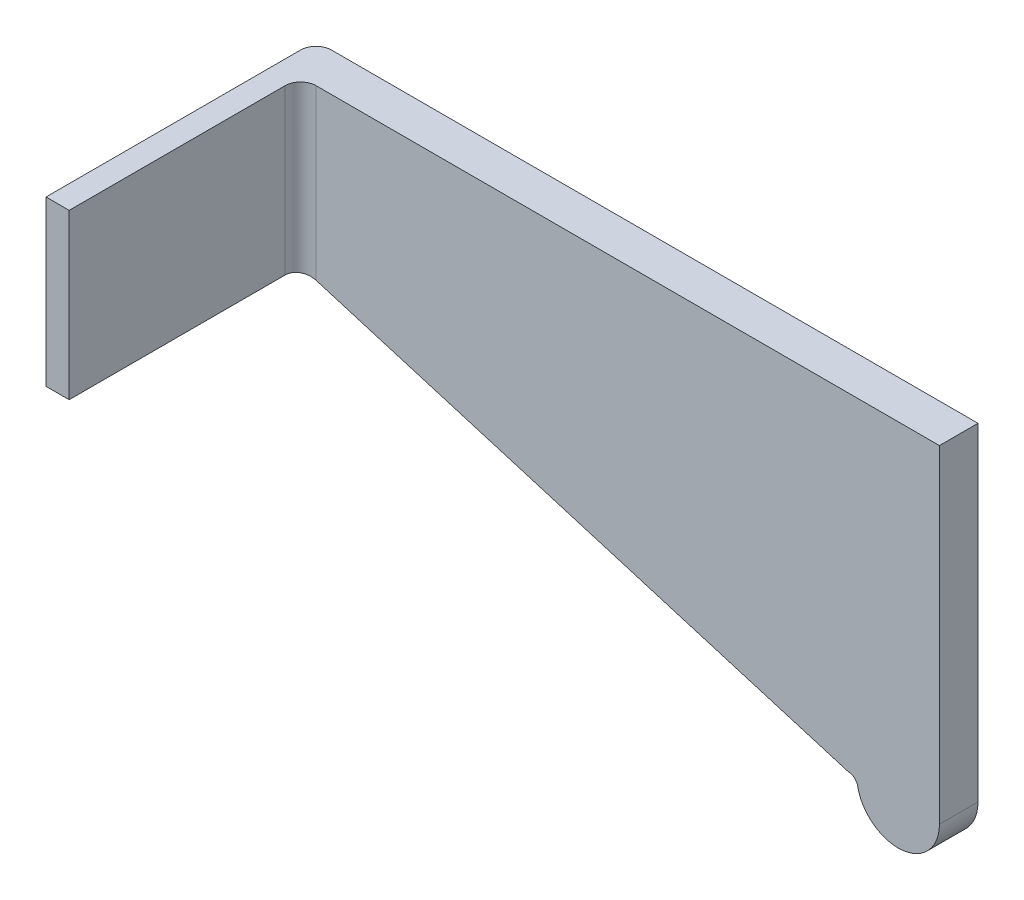
ISO-10303-21;
HEADER;
FILE_DESCRIPTION(('STEP AP214'),'2;1');
FILE_NAME('part.step','',(''),(''),'','','');
FILE_SCHEMA(('AUTOMOTIVE_DESIGN { 1 0 10303 214 1 1 1 1 }'));
ENDSEC;
DATA;
#1=APPLICATION_CONTEXT('core data for automotive mechanical design processes');
#2=APPLICATION_PROTOCOL_DEFINITION('international standard','automotive_design',2000,#1);
#3=PRODUCT_CONTEXT('',#1,'mechanical');
#4=PRODUCT('Part','Part','',(#3));
#5=PRODUCT_RELATED_PRODUCT_CATEGORY('part','',(#4));
#6=PRODUCT_DEFINITION_FORMATION('','',#4);
#7=PRODUCT_DEFINITION_CONTEXT('part definition',#1,'design');
#8=PRODUCT_DEFINITION('design','',#6,#7);
#9=PRODUCT_DEFINITION_SHAPE('','',#8);
#10=(LENGTH_UNIT() NAMED_UNIT(*) SI_UNIT(.MILLI.,.METRE.));
#11=(NAMED_UNIT(*) PLANE_ANGLE_UNIT() SI_UNIT($,.RADIAN.));
#12=(NAMED_UNIT(*) SI_UNIT($,.STERADIAN.) SOLID_ANGLE_UNIT());
#13=UNCERTAINTY_MEASURE_WITH_UNIT(LENGTH_MEASURE(1.E-05),#10,'distance_accuracy_value','');
#14=(GEOMETRIC_REPRESENTATION_CONTEXT(3) GLOBAL_UNCERTAINTY_ASSIGNED_CONTEXT((#13)) GLOBAL_UNIT_ASSIGNED_CONTEXT((#10,
#11,#12)) REPRESENTATION_CONTEXT('',''));
#15=CARTESIAN_POINT('',(0.,0.,0.));
#16=DIRECTION('',(0.,0.,1.));
#17=DIRECTION('',(1.,0.,0.));
#18=AXIS2_PLACEMENT_3D('',#15,#16,#17);
#19=CARTESIAN_POINT('',(-75.4580031388098,21.2470896781961,7.));
#20=DIRECTION('',(0.,-1.,0.));
#21=DIRECTION('',(0.,0.,-1.));
#22=AXIS2_PLACEMENT_3D('',#19,#20,#21);
#23=CYLINDRICAL_SURFACE('',#22,2.);
#24=DIRECTION('',(0.,1.,0.));
#25=VECTOR('',#24,1.);
#26=CARTESIAN_POINT('',(-77.4580031388098,21.2470896781961,7.));
#27=LINE('',#26,#25);
#28=CARTESIAN_POINT('',(-77.4580031388098,21.2535448390981,7.00000000000001));
#29=VERTEX_POINT('',#28);
#30=CARTESIAN_POINT('',(-77.4580031388098,42.5070896781962,7.));
#31=VERTEX_POINT('',#30);
#32=EDGE_CURVE('E266',#29,#31,#27,.T.);
#33=ORIENTED_EDGE('',*,*,#32,.F.);
#34=CARTESIAN_POINT('',(-75.4580031388098,20.6545045645001,7.));
#35=DIRECTION('',(0.286926127643944,0.957952711398246,0.));
#36=DIRECTION('',(0.957952711398246,-0.286926127643944,0.));
#37=AXIS2_PLACEMENT_3D('',#34,#35,#36);
#38=ELLIPSE('',#37,2.08778572908966,2.);
#39=CARTESIAN_POINT('',(-75.4580031388098,20.6545045645001,5.));
#40=VERTEX_POINT('',#39);
#41=EDGE_CURVE('E47',#29,#40,#38,.F.);
#42=ORIENTED_EDGE('',*,*,#41,.T.);
#43=DIRECTION('',(0.,1.,0.));
#44=VECTOR('',#43,1.);
#45=CARTESIAN_POINT('',(-75.4580031388098,21.2470896781961,5.));
#46=LINE('',#45,#44);
#47=CARTESIAN_POINT('',(-75.4580031388098,42.5070896781962,5.));
#48=VERTEX_POINT('',#47);
#49=EDGE_CURVE('E273',#48,#40,#46,.F.);
#50=ORIENTED_EDGE('',*,*,#49,.F.);
#51=CARTESIAN_POINT('',(-75.4580031388098,42.5070896781962,7.));
#52=DIRECTION('',(0.,-1.,0.));
#53=DIRECTION('',(0.,0.,-1.));
#54=AXIS2_PLACEMENT_3D('',#51,#52,#53);
#55=CIRCLE('',#54,2.);
#56=EDGE_CURVE('E11',#48,#31,#55,.F.);
#57=ORIENTED_EDGE('',*,*,#56,.T.);
#58=EDGE_LOOP('',(#33,#42,#50,#57));
#59=FACE_BOUND('',#58,.T.);
#60=ADVANCED_FACE('F39',(#59),#23,.F.);
#61=CARTESIAN_POINT('',(0.,0.,5.));
#62=DIRECTION('',(0.,0.,1.));
#63=DIRECTION('',(1.,0.,0.));
#64=AXIS2_PLACEMENT_3D('',#61,#62,#63);
#65=PLANE('',#64);
#66=DIRECTION('',(-1.,0.,0.));
#67=VECTOR('',#66,1.);
#68=CARTESIAN_POINT('',(-5.34810484739101,42.5070896781962,5.));
#69=LINE('',#68,#67);
#70=CARTESIAN_POINT('',(5.34810484739101,42.5070896781962,5.));
#71=VERTEX_POINT('',#70);
#72=EDGE_CURVE('E191',#71,#48,#69,.T.);
#73=ORIENTED_EDGE('',*,*,#72,.T.);
#74=ORIENTED_EDGE('',*,*,#49,.T.);
#75=DIRECTION('',(-0.957952711398246,0.286926127643944,0.));
#76=VECTOR('',#75,1.);
#77=CARTESIAN_POINT('',(-77.4580031388098,21.2535448390981,5.));
#78=LINE('',#77,#76);
#79=CARTESIAN_POINT('',(-6.49935230899251,0.,5.));
#80=VERTEX_POINT('',#79);
#81=EDGE_CURVE('E173',#80,#40,#78,.T.);
#82=ORIENTED_EDGE('',*,*,#81,.F.);
#83=CARTESIAN_POINT('',(-6.49935230899251,-1.27515777709302,5.));
#84=DIRECTION('',(0.,0.,1.));
#85=DIRECTION('',(1.,0.,0.));
#86=AXIS2_PLACEMENT_3D('',#83,#84,#85);
#87=CIRCLE('',#86,1.27515777709302);
#88=CARTESIAN_POINT('',(-5.24805062993144,-1.029655303664,5.));
#89=VERTEX_POINT('',#88);
#90=EDGE_CURVE('E230',#80,#89,#87,.F.);
#91=ORIENTED_EDGE('',*,*,#90,.T.);
#92=CARTESIAN_POINT('',(0.,0.,5.));
#93=DIRECTION('',(0.,0.,1.));
#94=DIRECTION('',(1.,0.,0.));
#95=AXIS2_PLACEMENT_3D('',#92,#93,#94);
#96=CIRCLE('',#95,5.34810484739101);
#97=CARTESIAN_POINT('',(5.34810484739101,0.,5.));
#98=VERTEX_POINT('',#97);
#99=EDGE_CURVE('E202',#89,#98,#96,.T.);
#100=ORIENTED_EDGE('',*,*,#99,.T.);
#101=DIRECTION('',(0.,1.,0.));
#102=VECTOR('',#101,1.);
#103=CARTESIAN_POINT('',(5.34810484739101,0.,5.));
#104=LINE('',#103,#102);
#105=EDGE_CURVE('E205',#98,#71,#104,.T.);
#106=ORIENTED_EDGE('',*,*,#105,.T.);
#107=EDGE_LOOP('',(#73,#74,#82,#91,#100,#106));
#108=FACE_BOUND('',#107,.T.);
#109=ADVANCED_FACE('F278',(#108),#65,.T.);
#110=CARTESIAN_POINT('',(-78.4580031388098,0.,2.));
#111=DIRECTION('',(0.,-1.,0.));
#112=DIRECTION('',(0.,0.,-1.));
#113=AXIS2_PLACEMENT_3D('',#110,#111,#112);
#114=CYLINDRICAL_SURFACE('',#113,2.);
#115=DIRECTION('',(0.,1.,0.));
#116=VECTOR('',#115,1.);
#117=CARTESIAN_POINT('',(-78.4580031388098,0.,0.));
#118=LINE('',#117,#116);
#119=CARTESIAN_POINT('',(-78.4580031388098,21.2470896781961,0.));
#120=VERTEX_POINT('',#119);
#121=CARTESIAN_POINT('',(-78.4580031388098,42.5070896781962,0.));
#122=VERTEX_POINT('',#121);
#123=EDGE_CURVE('E250',#120,#122,#118,.T.);
#124=ORIENTED_EDGE('',*,*,#123,.F.);
#125=CARTESIAN_POINT('',(-78.4580031388098,21.2470896781961,2.));
#126=DIRECTION('',(0.,-1.,0.));
#127=DIRECTION('',(0.,0.,-1.));
#128=AXIS2_PLACEMENT_3D('',#125,#126,#127);
#129=CIRCLE('',#128,2.);
#130=CARTESIAN_POINT('',(-80.4580031388098,21.2470896781961,2.));
#131=VERTEX_POINT('',#130);
#132=EDGE_CURVE('E256',#131,#120,#129,.T.);
#133=ORIENTED_EDGE('',*,*,#132,.F.);
#134=DIRECTION('',(0.,1.,0.));
#135=VECTOR('',#134,1.);
#136=CARTESIAN_POINT('',(-80.4580031388098,0.,2.));
#137=LINE('',#136,#135);
#138=CARTESIAN_POINT('',(-80.4580031388098,42.5070896781962,2.));
#139=VERTEX_POINT('',#138);
#140=EDGE_CURVE('E138',#139,#131,#137,.F.);
#141=ORIENTED_EDGE('',*,*,#140,.F.);
#142=CARTESIAN_POINT('',(-78.4580031388098,42.5070896781962,2.));
#143=DIRECTION('',(0.,-1.,0.));
#144=DIRECTION('',(0.,0.,-1.));
#145=AXIS2_PLACEMENT_3D('',#142,#143,#144);
#146=CIRCLE('',#145,2.);
#147=EDGE_CURVE('E259',#122,#139,#146,.F.);
#148=ORIENTED_EDGE('',*,*,#147,.F.);
#149=EDGE_LOOP('',(#124,#133,#141,#148));
#150=FACE_BOUND('',#149,.T.);
#151=ADVANCED_FACE('F303',(#150),#114,.T.);
#152=CARTESIAN_POINT('',(-78.0226272699365,17.2470896781961,35.));
#153=DIRECTION('',(0.,0.,1.));
#154=DIRECTION('',(1.,0.,0.));
#155=AXIS2_PLACEMENT_3D('',#152,#153,#154);
#156=CYLINDRICAL_SURFACE('',#155,4.);
#157=DIRECTION('',(0.,0.,1.));
#158=VECTOR('',#157,1.);
#159=CARTESIAN_POINT('',(-78.0226272699365,21.2470896781961,35.));
#160=LINE('',#159,#158);
#161=CARTESIAN_POINT('',(-78.0226272699365,21.2470896781961,0.));
#162=VERTEX_POINT('',#161);
#163=CARTESIAN_POINT('',(-78.0226272699365,21.2470896781961,5.));
#164=VERTEX_POINT('',#163);
#165=EDGE_CURVE('E236',#162,#164,#160,.T.);
#166=ORIENTED_EDGE('',*,*,#165,.F.);
#167=CARTESIAN_POINT('',(-78.0226272699365,17.2470896781961,0.));
#168=DIRECTION('',(0.,0.,1.));
#169=DIRECTION('',(1.,0.,0.));
#170=AXIS2_PLACEMENT_3D('',#167,#168,#169);
#171=CIRCLE('',#170,4.);
#172=CARTESIAN_POINT('',(-76.8749227593607,21.0789005237891,0.));
#173=VERTEX_POINT('',#172);
#174=EDGE_CURVE('E244',#162,#173,#171,.F.);
#175=ORIENTED_EDGE('',*,*,#174,.T.);
#176=DIRECTION('',(0.,0.,1.));
#177=VECTOR('',#176,1.);
#178=CARTESIAN_POINT('',(-76.8749227593607,21.0789005237891,0.));
#179=LINE('',#178,#177);
#180=CARTESIAN_POINT('',(-76.8749227593607,21.0789005237891,5.));
#181=VERTEX_POINT('',#180);
#182=EDGE_CURVE('E240',#181,#173,#179,.F.);
#183=ORIENTED_EDGE('',*,*,#182,.F.);
#184=CARTESIAN_POINT('',(-78.0226272699365,17.2470896781961,5.));
#185=DIRECTION('',(0.,0.,1.));
#186=DIRECTION('',(1.,0.,0.));
#187=AXIS2_PLACEMENT_3D('',#184,#185,#186);
#188=CIRCLE('',#187,4.);
#189=EDGE_CURVE('E247',#181,#164,#188,.T.);
#190=ORIENTED_EDGE('',*,*,#189,.T.);
#191=EDGE_LOOP('',(#166,#175,#183,#190));
#192=FACE_BOUND('',#191,.T.);
#193=ADVANCED_FACE('F316',(#192),#156,.F.);
#194=CARTESIAN_POINT('',(0.,0.,5.));
#195=DIRECTION('',(0.,0.,-1.));
#196=DIRECTION('',(-1.,0.,0.));
#197=AXIS2_PLACEMENT_3D('',#194,#195,#196);
#198=CYLINDRICAL_SURFACE('',#197,5.34810484739101);
#199=ORIENTED_EDGE('',*,*,#99,.F.);
#200=DIRECTION('',(0.,0.,-1.));
#201=VECTOR('',#200,1.);
#202=CARTESIAN_POINT('',(-5.24805062993144,-1.029655303664,5.));
#203=LINE('',#202,#201);
#204=CARTESIAN_POINT('',(-5.24805062993144,-1.029655303664,0.));
#205=VERTEX_POINT('',#204);
#206=EDGE_CURVE('E219',#89,#205,#203,.T.);
#207=ORIENTED_EDGE('',*,*,#206,.T.);
#208=CARTESIAN_POINT('',(0.,0.,0.));
#209=DIRECTION('',(0.,0.,1.));
#210=DIRECTION('',(1.,0.,0.));
#211=AXIS2_PLACEMENT_3D('',#208,#209,#210);
#212=CIRCLE('',#211,5.34810484739101);
#213=CARTESIAN_POINT('',(5.34810484739101,0.,0.));
#214=VERTEX_POINT('',#213);
#215=EDGE_CURVE('E198',#205,#214,#212,.T.);
#216=ORIENTED_EDGE('',*,*,#215,.T.);
#217=DIRECTION('',(0.,0.,-1.));
#218=VECTOR('',#217,1.);
#219=CARTESIAN_POINT('',(5.34810484739101,0.,5.));
#220=LINE('',#219,#218);
#221=EDGE_CURVE('E210',#98,#214,#220,.T.);
#222=ORIENTED_EDGE('',*,*,#221,.F.);
#223=EDGE_LOOP('',(#199,#207,#216,#222));
#224=FACE_BOUND('',#223,.T.);
#225=ADVANCED_FACE('F291',(#224),#198,.T.);
#226=CARTESIAN_POINT('',(5.34810484739101,0.,5.));
#227=DIRECTION('',(-1.,0.,0.));
#228=DIRECTION('',(0.,0.,1.));
#229=AXIS2_PLACEMENT_3D('',#226,#227,#228);
#230=PLANE('',#229);
#231=DIRECTION('',(0.,1.,0.));
#232=VECTOR('',#231,1.);
#233=CARTESIAN_POINT('',(5.34810484739101,0.,0.));
#234=LINE('',#233,#232);
#235=CARTESIAN_POINT('',(5.34810484739101,42.5070896781962,0.));
#236=VERTEX_POINT('',#235);
#237=EDGE_CURVE('E206',#214,#236,#234,.T.);
#238=ORIENTED_EDGE('',*,*,#237,.T.);
#239=DIRECTION('',(0.,0.,1.));
#240=VECTOR('',#239,1.);
#241=CARTESIAN_POINT('',(5.34810484739101,42.5070896781962,0.));
#242=LINE('',#241,#240);
#243=EDGE_CURVE('E183',#236,#71,#242,.T.);
#244=ORIENTED_EDGE('',*,*,#243,.T.);
#245=ORIENTED_EDGE('',*,*,#105,.F.);
#246=ORIENTED_EDGE('',*,*,#221,.T.);
#247=EDGE_LOOP('',(#238,#244,#245,#246));
#248=FACE_BOUND('',#247,.T.);
#249=ADVANCED_FACE('F295',(#248),#230,.F.);
#250=ORIENTED_EDGE('',*,*,#189,.F.);
#251=DIRECTION('',(-0.957952711398246,0.286926127643944,0.));
#252=VECTOR('',#251,1.);
#253=CARTESIAN_POINT('',(-0.535069595510605,-1.7864227772321,5.));
#254=LINE('',#253,#252);
#255=CARTESIAN_POINT('',(-77.4580031388098,21.2535448390981,5.));
#256=VERTEX_POINT('',#255);
#257=EDGE_CURVE('E270',#181,#256,#254,.T.);
#258=ORIENTED_EDGE('',*,*,#257,.T.);
#259=DIRECTION('',(0.,-1.,0.));
#260=VECTOR('',#259,1.);
#261=CARTESIAN_POINT('',(-77.4580031388098,42.5070896781962,5.));
#262=LINE('',#261,#260);
#263=CARTESIAN_POINT('',(-77.4580031388098,21.2470896781961,5.));
#264=VERTEX_POINT('',#263);
#265=EDGE_CURVE('E195',#256,#264,#262,.T.);
#266=ORIENTED_EDGE('',*,*,#265,.T.);
#267=DIRECTION('',(1.,0.,0.));
#268=VECTOR('',#267,1.);
#269=CARTESIAN_POINT('',(0.,21.2470896781961,5.));
#270=LINE('',#269,#268);
#271=EDGE_CURVE('E233',#164,#264,#270,.T.);
#272=ORIENTED_EDGE('',*,*,#271,.F.);
#273=EDGE_LOOP('',(#250,#258,#266,#272));
#274=FACE_BOUND('',#273,.T.);
#275=ADVANCED_FACE('F312',(#274),#65,.T.);
#276=CARTESIAN_POINT('',(0.,0.,0.));
#277=DIRECTION('',(0.,0.,1.));
#278=DIRECTION('',(1.,0.,0.));
#279=AXIS2_PLACEMENT_3D('',#276,#277,#278);
#280=PLANE('',#279);
#281=DIRECTION('',(-1.,0.,0.));
#282=VECTOR('',#281,1.);
#283=CARTESIAN_POINT('',(-80.4580031388098,21.2470896781961,0.));
#284=LINE('',#283,#282);
#285=EDGE_CURVE('E161',#162,#120,#284,.T.);
#286=ORIENTED_EDGE('',*,*,#285,.T.);
#287=ORIENTED_EDGE('',*,*,#123,.T.);
#288=DIRECTION('',(-1.,0.,0.));
#289=VECTOR('',#288,1.);
#290=CARTESIAN_POINT('',(-5.34810484739101,42.5070896781962,0.));
#291=LINE('',#290,#289);
#292=EDGE_CURVE('E190',#236,#122,#291,.T.);
#293=ORIENTED_EDGE('',*,*,#292,.F.);
#294=ORIENTED_EDGE('',*,*,#237,.F.);
#295=ORIENTED_EDGE('',*,*,#215,.F.);
#296=CARTESIAN_POINT('',(-6.49935230899251,-1.27515777709302,0.));
#297=DIRECTION('',(0.,0.,1.));
#298=DIRECTION('',(1.,0.,0.));
#299=AXIS2_PLACEMENT_3D('',#296,#297,#298);
#300=CIRCLE('',#299,1.27515777709302);
#301=CARTESIAN_POINT('',(-6.49935230899251,0.,0.));
#302=VERTEX_POINT('',#301);
#303=EDGE_CURVE('E226',#205,#302,#300,.T.);
#304=ORIENTED_EDGE('',*,*,#303,.T.);
#305=DIRECTION('',(-0.957952711398246,0.286926127643944,0.));
#306=VECTOR('',#305,1.);
#307=CARTESIAN_POINT('',(-77.4580031388098,21.2535448390981,0.));
#308=LINE('',#307,#306);
#309=EDGE_CURVE('E179',#302,#173,#308,.T.);
#310=ORIENTED_EDGE('',*,*,#309,.T.);
#311=ORIENTED_EDGE('',*,*,#174,.F.);
#312=EDGE_LOOP('',(#286,#287,#293,#294,#295,#304,#310,#311));
#313=FACE_BOUND('',#312,.T.);
#314=ADVANCED_FACE('F299',(#313),#280,.F.);
#315=CARTESIAN_POINT('',(-5.34810484739101,42.5070896781962,5.));
#316=DIRECTION('',(0.,-1.,0.));
#317=DIRECTION('',(0.,0.,-1.));
#318=AXIS2_PLACEMENT_3D('',#315,#316,#317);
#319=PLANE('',#318);
#320=ORIENTED_EDGE('',*,*,#292,.T.);
#321=ORIENTED_EDGE('',*,*,#147,.T.);
#322=DIRECTION('',(0.,0.,-1.));
#323=VECTOR('',#322,1.);
#324=CARTESIAN_POINT('',(-80.4580031388098,42.5070896781962,35.));
#325=LINE('',#324,#323);
#326=CARTESIAN_POINT('',(-80.4580031388098,42.5070896781962,35.));
#327=VERTEX_POINT('',#326);
#328=EDGE_CURVE('E142',#327,#139,#325,.T.);
#329=ORIENTED_EDGE('',*,*,#328,.F.);
#330=DIRECTION('',(1.,0.,0.));
#331=VECTOR('',#330,1.);
#332=CARTESIAN_POINT('',(-77.4580031388098,42.5070896781962,35.));
#333=LINE('',#332,#331);
#334=CARTESIAN_POINT('',(-77.4580031388098,42.5070896781962,35.));
#335=VERTEX_POINT('',#334);
#336=EDGE_CURVE('E153',#327,#335,#333,.T.);
#337=ORIENTED_EDGE('',*,*,#336,.T.);
#338=DIRECTION('',(0.,0.,-1.));
#339=VECTOR('',#338,1.);
#340=CARTESIAN_POINT('',(-77.4580031388098,42.5070896781962,35.));
#341=LINE('',#340,#339);
#342=EDGE_CURVE('E174',#335,#31,#341,.T.);
#343=ORIENTED_EDGE('',*,*,#342,.T.);
#344=ORIENTED_EDGE('',*,*,#56,.F.);
#345=ORIENTED_EDGE('',*,*,#72,.F.);
#346=ORIENTED_EDGE('',*,*,#243,.F.);
#347=EDGE_LOOP('',(#320,#321,#329,#337,#343,#344,#345,#346));
#348=FACE_BOUND('',#347,.T.);
#349=ADVANCED_FACE('F297',(#348),#319,.F.);
#350=CARTESIAN_POINT('',(-6.49935230899251,-1.27515777709302,5.));
#351=DIRECTION('',(0.,0.,-1.));
#352=DIRECTION('',(-1.,0.,0.));
#353=AXIS2_PLACEMENT_3D('',#350,#351,#352);
#354=CYLINDRICAL_SURFACE('',#353,1.27515777709302);
#355=ORIENTED_EDGE('',*,*,#90,.F.);
#356=DIRECTION('',(0.,0.,1.));
#357=VECTOR('',#356,1.);
#358=CARTESIAN_POINT('',(-6.49935230899251,0.,5.));
#359=LINE('',#358,#357);
#360=EDGE_CURVE('E223',#302,#80,#359,.T.);
#361=ORIENTED_EDGE('',*,*,#360,.F.);
#362=ORIENTED_EDGE('',*,*,#303,.F.);
#363=ORIENTED_EDGE('',*,*,#206,.F.);
#364=EDGE_LOOP('',(#355,#361,#362,#363));
#365=FACE_BOUND('',#364,.T.);
#366=ADVANCED_FACE('F285',(#365),#354,.F.);
#367=CARTESIAN_POINT('',(-77.4580031388098,21.2535448390981,0.));
#368=DIRECTION('',(0.286926127643944,0.957952711398246,0.));
#369=DIRECTION('',(-0.957952711398246,0.286926127643944,0.));
#370=AXIS2_PLACEMENT_3D('',#367,#368,#369);
#371=PLANE('',#370);
#372=ORIENTED_EDGE('',*,*,#81,.T.);
#373=ORIENTED_EDGE('',*,*,#41,.F.);
#374=DIRECTION('',(0.,0.,1.));
#375=VECTOR('',#374,1.);
#376=CARTESIAN_POINT('',(-77.4580031388098,21.2535448390981,35.));
#377=LINE('',#376,#375);
#378=EDGE_CURVE('E262',#256,#29,#377,.T.);
#379=ORIENTED_EDGE('',*,*,#378,.F.);
#380=ORIENTED_EDGE('',*,*,#257,.F.);
#381=ORIENTED_EDGE('',*,*,#182,.T.);
#382=ORIENTED_EDGE('',*,*,#309,.F.);
#383=ORIENTED_EDGE('',*,*,#360,.T.);
#384=EDGE_LOOP('',(#372,#373,#379,#380,#381,#382,#383));
#385=FACE_BOUND('',#384,.T.);
#386=ADVANCED_FACE('F281',(#385),#371,.F.);
#387=CARTESIAN_POINT('',(-80.4580031388098,21.2470896781961,35.));
#388=DIRECTION('',(0.,-1.,0.));
#389=DIRECTION('',(0.,0.,-1.));
#390=AXIS2_PLACEMENT_3D('',#387,#388,#389);
#391=PLANE('',#390);
#392=DIRECTION('',(0.,0.,-1.));
#393=VECTOR('',#392,1.);
#394=CARTESIAN_POINT('',(-80.4580031388098,21.2470896781961,35.));
#395=LINE('',#394,#393);
#396=CARTESIAN_POINT('',(-80.4580031388098,21.2470896781961,35.));
#397=VERTEX_POINT('',#396);
#398=EDGE_CURVE('E132',#397,#131,#395,.T.);
#399=ORIENTED_EDGE('',*,*,#398,.T.);
#400=ORIENTED_EDGE('',*,*,#132,.T.);
#401=ORIENTED_EDGE('',*,*,#285,.F.);
#402=ORIENTED_EDGE('',*,*,#165,.T.);
#403=ORIENTED_EDGE('',*,*,#271,.T.);
#404=DIRECTION('',(0.,0.,-1.));
#405=VECTOR('',#404,1.);
#406=CARTESIAN_POINT('',(-77.4580031388098,21.2470896781961,35.));
#407=LINE('',#406,#405);
#408=CARTESIAN_POINT('',(-77.4580031388098,21.2470896781961,35.));
#409=VERTEX_POINT('',#408);
#410=EDGE_CURVE('E159',#409,#264,#407,.T.);
#411=ORIENTED_EDGE('',*,*,#410,.F.);
#412=DIRECTION('',(-1.,0.,0.));
#413=VECTOR('',#412,1.);
#414=CARTESIAN_POINT('',(-80.4580031388098,21.2470896781961,35.));
#415=LINE('',#414,#413);
#416=EDGE_CURVE('E150',#409,#397,#415,.T.);
#417=ORIENTED_EDGE('',*,*,#416,.T.);
#418=EDGE_LOOP('',(#399,#400,#401,#402,#403,#411,#417));
#419=FACE_BOUND('',#418,.T.);
#420=ADVANCED_FACE('F156',(#419),#391,.T.);
#421=CARTESIAN_POINT('',(-77.4580031388098,21.2470896781961,35.));
#422=DIRECTION('',(1.,0.,0.));
#423=DIRECTION('',(0.,0.,-1.));
#424=AXIS2_PLACEMENT_3D('',#421,#422,#423);
#425=PLANE('',#424);
#426=ORIENTED_EDGE('',*,*,#378,.T.);
#427=ORIENTED_EDGE('',*,*,#32,.T.);
#428=ORIENTED_EDGE('',*,*,#342,.F.);
#429=DIRECTION('',(0.,-1.,0.));
#430=VECTOR('',#429,1.);
#431=CARTESIAN_POINT('',(-77.4580031388098,21.2470896781961,35.));
#432=LINE('',#431,#430);
#433=EDGE_CURVE('E143',#335,#409,#432,.T.);
#434=ORIENTED_EDGE('',*,*,#433,.T.);
#435=ORIENTED_EDGE('',*,*,#410,.T.);
#436=ORIENTED_EDGE('',*,*,#265,.F.);
#437=EDGE_LOOP('',(#426,#427,#428,#434,#435,#436));
#438=FACE_BOUND('',#437,.T.);
#439=ADVANCED_FACE('F305',(#438),#425,.T.);
#440=CARTESIAN_POINT('',(-80.4580031388098,42.5070896781962,35.));
#441=DIRECTION('',(-1.,0.,0.));
#442=DIRECTION('',(0.,0.,1.));
#443=AXIS2_PLACEMENT_3D('',#440,#441,#442);
#444=PLANE('',#443);
#445=ORIENTED_EDGE('',*,*,#328,.T.);
#446=ORIENTED_EDGE('',*,*,#140,.T.);
#447=ORIENTED_EDGE('',*,*,#398,.F.);
#448=DIRECTION('',(0.,1.,0.));
#449=VECTOR('',#448,1.);
#450=CARTESIAN_POINT('',(-80.4580031388098,42.5070896781962,35.));
#451=LINE('',#450,#449);
#452=EDGE_CURVE('E136',#397,#327,#451,.T.);
#453=ORIENTED_EDGE('',*,*,#452,.T.);
#454=EDGE_LOOP('',(#445,#446,#447,#453));
#455=FACE_BOUND('',#454,.T.);
#456=ADVANCED_FACE('F135',(#455),#444,.T.);
#457=CARTESIAN_POINT('',(0.,0.,35.));
#458=DIRECTION('',(0.,0.,1.));
#459=DIRECTION('',(1.,0.,0.));
#460=AXIS2_PLACEMENT_3D('',#457,#458,#459);
#461=PLANE('',#460);
#462=ORIENTED_EDGE('',*,*,#416,.F.);
#463=ORIENTED_EDGE('',*,*,#433,.F.);
#464=ORIENTED_EDGE('',*,*,#336,.F.);
#465=ORIENTED_EDGE('',*,*,#452,.F.);
#466=EDGE_LOOP('',(#462,#463,#464,#465));
#467=FACE_BOUND('',#466,.T.);
#468=ADVANCED_FACE('F148',(#467),#461,.T.);
#469=CLOSED_SHELL('',(#60,#109,#151,#193,#225,#249,#275,#314,#349,#366,#386,#420,#439,#456,#468));
#470=MANIFOLD_SOLID_BREP('B2',#469);
#471=ADVANCED_BREP_SHAPE_REPRESENTATION('',(#18,#470),#14);
#472=SHAPE_DEFINITION_REPRESENTATION(#9,#471);
ENDSEC;
END-ISO-10303-21;
